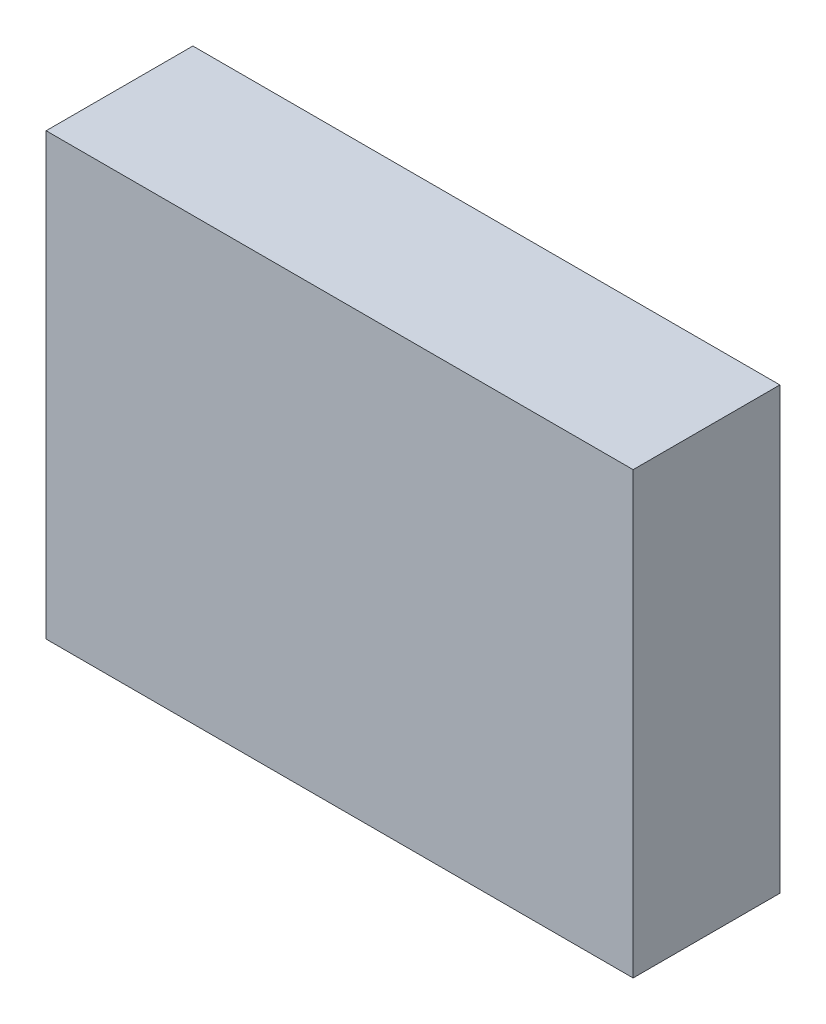
ISO-10303-21;
HEADER;
FILE_DESCRIPTION(('STEP AP214'),'2;1');
FILE_NAME('part.step','',(''),(''),'','','');
FILE_SCHEMA(('AUTOMOTIVE_DESIGN { 1 0 10303 214 1 1 1 1 }'));
ENDSEC;
DATA;
#1=APPLICATION_CONTEXT('core data for automotive mechanical design processes');
#2=APPLICATION_PROTOCOL_DEFINITION('international standard','automotive_design',2000,#1);
#3=PRODUCT_CONTEXT('',#1,'mechanical');
#4=PRODUCT('Part','Part','',(#3));
#5=PRODUCT_RELATED_PRODUCT_CATEGORY('part','',(#4));
#6=PRODUCT_DEFINITION_FORMATION('','',#4);
#7=PRODUCT_DEFINITION_CONTEXT('part definition',#1,'design');
#8=PRODUCT_DEFINITION('design','',#6,#7);
#9=PRODUCT_DEFINITION_SHAPE('','',#8);
#10=(LENGTH_UNIT() NAMED_UNIT(*) SI_UNIT(.MILLI.,.METRE.));
#11=(NAMED_UNIT(*) PLANE_ANGLE_UNIT() SI_UNIT($,.RADIAN.));
#12=(NAMED_UNIT(*) SI_UNIT($,.STERADIAN.) SOLID_ANGLE_UNIT());
#13=UNCERTAINTY_MEASURE_WITH_UNIT(LENGTH_MEASURE(1.E-05),#10,'distance_accuracy_value','');
#14=(GEOMETRIC_REPRESENTATION_CONTEXT(3) GLOBAL_UNCERTAINTY_ASSIGNED_CONTEXT((#13)) GLOBAL_UNIT_ASSIGNED_CONTEXT((#10,
#11,#12)) REPRESENTATION_CONTEXT('',''));
#15=CARTESIAN_POINT('',(0.,0.,0.));
#16=DIRECTION('',(0.,0.,1.));
#17=DIRECTION('',(1.,0.,0.));
#18=AXIS2_PLACEMENT_3D('',#15,#16,#17);
#19=CARTESIAN_POINT('',(0.,0.,0.));
#20=DIRECTION('',(0.,0.,-1.));
#21=DIRECTION('',(-1.,0.,0.));
#22=AXIS2_PLACEMENT_3D('',#19,#20,#21);
#23=PLANE('',#22);
#24=CARTESIAN_POINT('',(-45.72,33.02,0.));
#25=DIRECTION('',(0.,0.,-1.));
#26=DIRECTION('',(-1.,0.,0.));
#27=AXIS2_PLACEMENT_3D('',#24,#25,#26);
#28=CIRCLE('',#27,2.794);
#29=CARTESIAN_POINT('',(-48.514,33.02,0.));
#30=VERTEX_POINT('',#29);
#31=EDGE_CURVE('E263',#30,#30,#28,.T.);
#32=ORIENTED_EDGE('',*,*,#31,.F.);
#33=EDGE_LOOP('',(#32));
#34=FACE_BOUND('',#33,.T.);
#35=CARTESIAN_POINT('',(45.72,33.02,0.));
#36=DIRECTION('',(0.,0.,-1.));
#37=DIRECTION('',(-1.,0.,0.));
#38=AXIS2_PLACEMENT_3D('',#35,#36,#37);
#39=CIRCLE('',#38,2.794);
#40=CARTESIAN_POINT('',(42.926,33.02,0.));
#41=VERTEX_POINT('',#40);
#42=EDGE_CURVE('E270',#41,#41,#39,.T.);
#43=ORIENTED_EDGE('',*,*,#42,.F.);
#44=EDGE_LOOP('',(#43));
#45=FACE_BOUND('',#44,.T.);
#46=CARTESIAN_POINT('',(45.72,-33.02,0.));
#47=DIRECTION('',(0.,0.,-1.));
#48=DIRECTION('',(-1.,0.,0.));
#49=AXIS2_PLACEMENT_3D('',#46,#47,#48);
#50=CIRCLE('',#49,2.794);
#51=CARTESIAN_POINT('',(42.926,-33.02,0.));
#52=VERTEX_POINT('',#51);
#53=EDGE_CURVE('E276',#52,#52,#50,.T.);
#54=ORIENTED_EDGE('',*,*,#53,.F.);
#55=EDGE_LOOP('',(#54));
#56=FACE_BOUND('',#55,.T.);
#57=CARTESIAN_POINT('',(-45.72,-33.02,0.));
#58=DIRECTION('',(0.,0.,-1.));
#59=DIRECTION('',(-1.,0.,0.));
#60=AXIS2_PLACEMENT_3D('',#57,#58,#59);
#61=CIRCLE('',#60,2.794);
#62=CARTESIAN_POINT('',(-48.514,-33.02,0.));
#63=VERTEX_POINT('',#62);
#64=EDGE_CURVE('E266',#63,#63,#61,.T.);
#65=ORIENTED_EDGE('',*,*,#64,.F.);
#66=EDGE_LOOP('',(#65));
#67=FACE_BOUND('',#66,.T.);
#68=DIRECTION('',(0.,1.,0.));
#69=VECTOR('',#68,1.);
#70=CARTESIAN_POINT('',(50.8,-38.1,0.));
#71=LINE('',#70,#69);
#72=CARTESIAN_POINT('',(50.8,-38.1,0.));
#73=VERTEX_POINT('',#72);
#74=CARTESIAN_POINT('',(50.8,38.1,0.));
#75=VERTEX_POINT('',#74);
#76=EDGE_CURVE('E284',#73,#75,#71,.T.);
#77=ORIENTED_EDGE('',*,*,#76,.F.);
#78=DIRECTION('',(1.,0.,0.));
#79=VECTOR('',#78,1.);
#80=CARTESIAN_POINT('',(-50.8,-38.1,0.));
#81=LINE('',#80,#79);
#82=CARTESIAN_POINT('',(-50.8,-38.1,0.));
#83=VERTEX_POINT('',#82);
#84=EDGE_CURVE('E77',#83,#73,#81,.T.);
#85=ORIENTED_EDGE('',*,*,#84,.F.);
#86=DIRECTION('',(0.,-1.,0.));
#87=VECTOR('',#86,1.);
#88=CARTESIAN_POINT('',(-50.8,-38.1,0.));
#89=LINE('',#88,#87);
#90=CARTESIAN_POINT('',(-50.8,38.1,0.));
#91=VERTEX_POINT('',#90);
#92=EDGE_CURVE('E298',#91,#83,#89,.T.);
#93=ORIENTED_EDGE('',*,*,#92,.F.);
#94=DIRECTION('',(-1.,0.,0.));
#95=VECTOR('',#94,1.);
#96=CARTESIAN_POINT('',(-50.8,38.1,0.));
#97=LINE('',#96,#95);
#98=EDGE_CURVE('E296',#75,#91,#97,.T.);
#99=ORIENTED_EDGE('',*,*,#98,.F.);
#100=EDGE_LOOP('',(#77,#85,#93,#99));
#101=FACE_BOUND('',#100,.T.);
#102=CARTESIAN_POINT('',(-45.72,-33.02,0.));
#103=DIRECTION('',(0.,0.,-1.));
#104=DIRECTION('',(-1.,0.,0.));
#105=AXIS2_PLACEMENT_3D('',#102,#103,#104);
#106=CIRCLE('',#105,5.334);
#107=CARTESIAN_POINT('',(-48.26,-28.3295889305947,0.));
#108=VERTEX_POINT('',#107);
#109=CARTESIAN_POINT('',(-41.0295889305947,-35.56,0.));
#110=VERTEX_POINT('',#109);
#111=EDGE_CURVE('E210',#108,#110,#106,.T.);
#112=ORIENTED_EDGE('',*,*,#111,.T.);
#113=DIRECTION('',(1.,0.,0.));
#114=VECTOR('',#113,1.);
#115=CARTESIAN_POINT('',(0.,-35.56,0.));
#116=LINE('',#115,#114);
#117=CARTESIAN_POINT('',(41.0295889305947,-35.56,0.));
#118=VERTEX_POINT('',#117);
#119=EDGE_CURVE('E172',#110,#118,#116,.T.);
#120=ORIENTED_EDGE('',*,*,#119,.T.);
#121=CARTESIAN_POINT('',(45.72,-33.02,0.));
#122=DIRECTION('',(0.,0.,-1.));
#123=DIRECTION('',(-1.,0.,0.));
#124=AXIS2_PLACEMENT_3D('',#121,#122,#123);
#125=CIRCLE('',#124,5.334);
#126=CARTESIAN_POINT('',(48.26,-28.3295889305947,0.));
#127=VERTEX_POINT('',#126);
#128=EDGE_CURVE('E214',#118,#127,#125,.T.);
#129=ORIENTED_EDGE('',*,*,#128,.T.);
#130=DIRECTION('',(0.,1.,0.));
#131=VECTOR('',#130,1.);
#132=CARTESIAN_POINT('',(48.26,0.,0.));
#133=LINE('',#132,#131);
#134=CARTESIAN_POINT('',(48.26,28.3295889305947,0.));
#135=VERTEX_POINT('',#134);
#136=EDGE_CURVE('E47',#127,#135,#133,.T.);
#137=ORIENTED_EDGE('',*,*,#136,.T.);
#138=CARTESIAN_POINT('',(45.72,33.02,0.));
#139=DIRECTION('',(0.,0.,-1.));
#140=DIRECTION('',(-1.,0.,0.));
#141=AXIS2_PLACEMENT_3D('',#138,#139,#140);
#142=CIRCLE('',#141,5.334);
#143=CARTESIAN_POINT('',(41.0295889305947,35.56,0.));
#144=VERTEX_POINT('',#143);
#145=EDGE_CURVE('E207',#135,#144,#142,.T.);
#146=ORIENTED_EDGE('',*,*,#145,.T.);
#147=DIRECTION('',(-1.,0.,0.));
#148=VECTOR('',#147,1.);
#149=CARTESIAN_POINT('',(0.,35.56,0.));
#150=LINE('',#149,#148);
#151=CARTESIAN_POINT('',(-41.0295889305947,35.56,0.));
#152=VERTEX_POINT('',#151);
#153=EDGE_CURVE('E194',#144,#152,#150,.T.);
#154=ORIENTED_EDGE('',*,*,#153,.T.);
#155=CARTESIAN_POINT('',(-45.72,33.02,0.));
#156=DIRECTION('',(0.,0.,-1.));
#157=DIRECTION('',(-1.,0.,0.));
#158=AXIS2_PLACEMENT_3D('',#155,#156,#157);
#159=CIRCLE('',#158,5.334);
#160=CARTESIAN_POINT('',(-48.26,28.3295889305947,0.));
#161=VERTEX_POINT('',#160);
#162=EDGE_CURVE('E206',#152,#161,#159,.T.);
#163=ORIENTED_EDGE('',*,*,#162,.T.);
#164=DIRECTION('',(0.,-1.,0.));
#165=VECTOR('',#164,1.);
#166=CARTESIAN_POINT('',(-48.26,0.,0.));
#167=LINE('',#166,#165);
#168=EDGE_CURVE('E198',#161,#108,#167,.T.);
#169=ORIENTED_EDGE('',*,*,#168,.T.);
#170=EDGE_LOOP('',(#112,#120,#129,#137,#146,#154,#163,#169));
#171=FACE_BOUND('',#170,.T.);
#172=ADVANCED_FACE('F32',(#34,#45,#56,#67,#101,#171),#23,.T.);
#173=CARTESIAN_POINT('',(50.8,-38.1,25.4));
#174=DIRECTION('',(-1.,0.,0.));
#175=DIRECTION('',(0.,0.,1.));
#176=AXIS2_PLACEMENT_3D('',#173,#174,#175);
#177=PLANE('',#176);
#178=ORIENTED_EDGE('',*,*,#76,.T.);
#179=DIRECTION('',(0.,0.,-1.));
#180=VECTOR('',#179,1.);
#181=CARTESIAN_POINT('',(50.8,38.1,25.4));
#182=LINE('',#181,#180);
#183=CARTESIAN_POINT('',(50.8,38.1,25.4));
#184=VERTEX_POINT('',#183);
#185=EDGE_CURVE('E11',#184,#75,#182,.T.);
#186=ORIENTED_EDGE('',*,*,#185,.F.);
#187=DIRECTION('',(0.,1.,0.));
#188=VECTOR('',#187,1.);
#189=CARTESIAN_POINT('',(50.8,-38.1,25.4));
#190=LINE('',#189,#188);
#191=CARTESIAN_POINT('',(50.8,-38.1,25.4));
#192=VERTEX_POINT('',#191);
#193=EDGE_CURVE('E287',#192,#184,#190,.T.);
#194=ORIENTED_EDGE('',*,*,#193,.F.);
#195=DIRECTION('',(0.,0.,-1.));
#196=VECTOR('',#195,1.);
#197=CARTESIAN_POINT('',(50.8,-38.1,25.4));
#198=LINE('',#197,#196);
#199=EDGE_CURVE('E293',#192,#73,#198,.T.);
#200=ORIENTED_EDGE('',*,*,#199,.T.);
#201=EDGE_LOOP('',(#178,#186,#194,#200));
#202=FACE_BOUND('',#201,.T.);
#203=ADVANCED_FACE('F34',(#202),#177,.F.);
#204=CARTESIAN_POINT('',(-50.8,38.1,25.4));
#205=DIRECTION('',(0.,-1.,0.));
#206=DIRECTION('',(0.,0.,-1.));
#207=AXIS2_PLACEMENT_3D('',#204,#205,#206);
#208=PLANE('',#207);
#209=ORIENTED_EDGE('',*,*,#98,.T.);
#210=DIRECTION('',(0.,0.,-1.));
#211=VECTOR('',#210,1.);
#212=CARTESIAN_POINT('',(-50.8,38.1,25.4));
#213=LINE('',#212,#211);
#214=CARTESIAN_POINT('',(-50.8,38.1,25.4));
#215=VERTEX_POINT('',#214);
#216=EDGE_CURVE('E40',#215,#91,#213,.T.);
#217=ORIENTED_EDGE('',*,*,#216,.F.);
#218=DIRECTION('',(-1.,0.,0.));
#219=VECTOR('',#218,1.);
#220=CARTESIAN_POINT('',(-50.8,38.1,25.4));
#221=LINE('',#220,#219);
#222=EDGE_CURVE('E84',#184,#215,#221,.T.);
#223=ORIENTED_EDGE('',*,*,#222,.F.);
#224=ORIENTED_EDGE('',*,*,#185,.T.);
#225=EDGE_LOOP('',(#209,#217,#223,#224));
#226=FACE_BOUND('',#225,.T.);
#227=ADVANCED_FACE('F325',(#226),#208,.F.);
#228=CARTESIAN_POINT('',(-50.8,-38.1,25.4));
#229=DIRECTION('',(1.,0.,0.));
#230=DIRECTION('',(0.,0.,-1.));
#231=AXIS2_PLACEMENT_3D('',#228,#229,#230);
#232=PLANE('',#231);
#233=ORIENTED_EDGE('',*,*,#92,.T.);
#234=DIRECTION('',(0.,0.,-1.));
#235=VECTOR('',#234,1.);
#236=CARTESIAN_POINT('',(-50.8,-38.1,25.4));
#237=LINE('',#236,#235);
#238=CARTESIAN_POINT('',(-50.8,-38.1,25.4));
#239=VERTEX_POINT('',#238);
#240=EDGE_CURVE('E302',#239,#83,#237,.T.);
#241=ORIENTED_EDGE('',*,*,#240,.F.);
#242=DIRECTION('',(0.,-1.,0.));
#243=VECTOR('',#242,1.);
#244=CARTESIAN_POINT('',(-50.8,-38.1,25.4));
#245=LINE('',#244,#243);
#246=EDGE_CURVE('E290',#215,#239,#245,.T.);
#247=ORIENTED_EDGE('',*,*,#246,.F.);
#248=ORIENTED_EDGE('',*,*,#216,.T.);
#249=EDGE_LOOP('',(#233,#241,#247,#248));
#250=FACE_BOUND('',#249,.T.);
#251=ADVANCED_FACE('F307',(#250),#232,.F.);
#252=CARTESIAN_POINT('',(-50.8,-38.1,25.4));
#253=DIRECTION('',(0.,1.,0.));
#254=DIRECTION('',(0.,0.,1.));
#255=AXIS2_PLACEMENT_3D('',#252,#253,#254);
#256=PLANE('',#255);
#257=ORIENTED_EDGE('',*,*,#84,.T.);
#258=ORIENTED_EDGE('',*,*,#199,.F.);
#259=DIRECTION('',(1.,0.,0.));
#260=VECTOR('',#259,1.);
#261=CARTESIAN_POINT('',(-50.8,-38.1,25.4));
#262=LINE('',#261,#260);
#263=EDGE_CURVE('E56',#239,#192,#262,.T.);
#264=ORIENTED_EDGE('',*,*,#263,.F.);
#265=ORIENTED_EDGE('',*,*,#240,.T.);
#266=EDGE_LOOP('',(#257,#258,#264,#265));
#267=FACE_BOUND('',#266,.T.);
#268=ADVANCED_FACE('F315',(#267),#256,.F.);
#269=CARTESIAN_POINT('',(0.,0.,25.4));
#270=DIRECTION('',(0.,0.,-1.));
#271=DIRECTION('',(-1.,0.,0.));
#272=AXIS2_PLACEMENT_3D('',#269,#270,#271);
#273=PLANE('',#272);
#274=ORIENTED_EDGE('',*,*,#193,.T.);
#275=ORIENTED_EDGE('',*,*,#222,.T.);
#276=ORIENTED_EDGE('',*,*,#246,.T.);
#277=ORIENTED_EDGE('',*,*,#263,.T.);
#278=EDGE_LOOP('',(#274,#275,#276,#277));
#279=FACE_BOUND('',#278,.T.);
#280=ADVANCED_FACE('F317',(#279),#273,.F.);
#281=CARTESIAN_POINT('',(-45.72,-33.02,10.16));
#282=DIRECTION('',(0.,0.,-1.));
#283=DIRECTION('',(-1.,0.,0.));
#284=AXIS2_PLACEMENT_3D('',#281,#282,#283);
#285=CYLINDRICAL_SURFACE('',#284,2.794);
#286=CARTESIAN_POINT('',(-45.72,-33.02,10.16));
#287=DIRECTION('',(0.,0.,-1.));
#288=DIRECTION('',(-1.,0.,0.));
#289=AXIS2_PLACEMENT_3D('',#286,#287,#288);
#290=CIRCLE('',#289,2.794);
#291=CARTESIAN_POINT('',(-48.514,-33.02,10.16));
#292=VERTEX_POINT('',#291);
#293=EDGE_CURVE('E281',#292,#292,#290,.T.);
#294=ORIENTED_EDGE('',*,*,#293,.F.);
#295=EDGE_LOOP('',(#294));
#296=FACE_BOUND('',#295,.T.);
#297=ORIENTED_EDGE('',*,*,#64,.T.);
#298=EDGE_LOOP('',(#297));
#299=FACE_BOUND('',#298,.T.);
#300=ADVANCED_FACE('F323',(#296,#299),#285,.F.);
#301=CARTESIAN_POINT('',(-45.72,-33.02,10.16));
#302=DIRECTION('',(0.,0.,-1.));
#303=DIRECTION('',(-1.,0.,0.));
#304=AXIS2_PLACEMENT_3D('',#301,#302,#303);
#305=PLANE('',#304);
#306=ORIENTED_EDGE('',*,*,#293,.T.);
#307=EDGE_LOOP('',(#306));
#308=FACE_BOUND('',#307,.T.);
#309=ADVANCED_FACE('F338',(#308),#305,.T.);
#310=CARTESIAN_POINT('',(45.72,-33.02,10.16));
#311=DIRECTION('',(0.,0.,-1.));
#312=DIRECTION('',(-1.,0.,0.));
#313=AXIS2_PLACEMENT_3D('',#310,#311,#312);
#314=CYLINDRICAL_SURFACE('',#313,2.794);
#315=CARTESIAN_POINT('',(45.72,-33.02,10.16));
#316=DIRECTION('',(0.,0.,-1.));
#317=DIRECTION('',(-1.,0.,0.));
#318=AXIS2_PLACEMENT_3D('',#315,#316,#317);
#319=CIRCLE('',#318,2.794);
#320=CARTESIAN_POINT('',(42.926,-33.02,10.16));
#321=VERTEX_POINT('',#320);
#322=EDGE_CURVE('E262',#321,#321,#319,.T.);
#323=ORIENTED_EDGE('',*,*,#322,.F.);
#324=EDGE_LOOP('',(#323));
#325=FACE_BOUND('',#324,.T.);
#326=ORIENTED_EDGE('',*,*,#53,.T.);
#327=EDGE_LOOP('',(#326));
#328=FACE_BOUND('',#327,.T.);
#329=ADVANCED_FACE('F342',(#325,#328),#314,.F.);
#330=CARTESIAN_POINT('',(45.72,-33.02,10.16));
#331=DIRECTION('',(0.,0.,-1.));
#332=DIRECTION('',(-1.,0.,0.));
#333=AXIS2_PLACEMENT_3D('',#330,#331,#332);
#334=PLANE('',#333);
#335=ORIENTED_EDGE('',*,*,#322,.T.);
#336=EDGE_LOOP('',(#335));
#337=FACE_BOUND('',#336,.T.);
#338=ADVANCED_FACE('F344',(#337),#334,.T.);
#339=CARTESIAN_POINT('',(45.72,33.02,10.16));
#340=DIRECTION('',(0.,0.,-1.));
#341=DIRECTION('',(-1.,0.,0.));
#342=AXIS2_PLACEMENT_3D('',#339,#340,#341);
#343=CYLINDRICAL_SURFACE('',#342,2.794);
#344=CARTESIAN_POINT('',(45.72,33.02,10.16));
#345=DIRECTION('',(0.,0.,-1.));
#346=DIRECTION('',(-1.,0.,0.));
#347=AXIS2_PLACEMENT_3D('',#344,#345,#346);
#348=CIRCLE('',#347,2.794);
#349=CARTESIAN_POINT('',(42.926,33.02,10.16));
#350=VERTEX_POINT('',#349);
#351=EDGE_CURVE('E273',#350,#350,#348,.T.);
#352=ORIENTED_EDGE('',*,*,#351,.F.);
#353=EDGE_LOOP('',(#352));
#354=FACE_BOUND('',#353,.T.);
#355=ORIENTED_EDGE('',*,*,#42,.T.);
#356=EDGE_LOOP('',(#355));
#357=FACE_BOUND('',#356,.T.);
#358=ADVANCED_FACE('F347',(#354,#357),#343,.F.);
#359=CARTESIAN_POINT('',(45.72,33.02,10.16));
#360=DIRECTION('',(0.,0.,-1.));
#361=DIRECTION('',(-1.,0.,0.));
#362=AXIS2_PLACEMENT_3D('',#359,#360,#361);
#363=PLANE('',#362);
#364=ORIENTED_EDGE('',*,*,#351,.T.);
#365=EDGE_LOOP('',(#364));
#366=FACE_BOUND('',#365,.T.);
#367=ADVANCED_FACE('F352',(#366),#363,.T.);
#368=CARTESIAN_POINT('',(-45.72,33.02,10.16));
#369=DIRECTION('',(0.,0.,-1.));
#370=DIRECTION('',(-1.,0.,0.));
#371=AXIS2_PLACEMENT_3D('',#368,#369,#370);
#372=CYLINDRICAL_SURFACE('',#371,2.794);
#373=CARTESIAN_POINT('',(-45.72,33.02,10.16));
#374=DIRECTION('',(0.,0.,-1.));
#375=DIRECTION('',(-1.,0.,0.));
#376=AXIS2_PLACEMENT_3D('',#373,#374,#375);
#377=CIRCLE('',#376,2.794);
#378=CARTESIAN_POINT('',(-48.514,33.02,10.16));
#379=VERTEX_POINT('',#378);
#380=EDGE_CURVE('E267',#379,#379,#377,.T.);
#381=ORIENTED_EDGE('',*,*,#380,.F.);
#382=EDGE_LOOP('',(#381));
#383=FACE_BOUND('',#382,.T.);
#384=ORIENTED_EDGE('',*,*,#31,.T.);
#385=EDGE_LOOP('',(#384));
#386=FACE_BOUND('',#385,.T.);
#387=ADVANCED_FACE('F355',(#383,#386),#372,.F.);
#388=CARTESIAN_POINT('',(-45.72,33.02,10.16));
#389=DIRECTION('',(0.,0.,-1.));
#390=DIRECTION('',(-1.,0.,0.));
#391=AXIS2_PLACEMENT_3D('',#388,#389,#390);
#392=PLANE('',#391);
#393=ORIENTED_EDGE('',*,*,#380,.T.);
#394=EDGE_LOOP('',(#393));
#395=FACE_BOUND('',#394,.T.);
#396=ADVANCED_FACE('F360',(#395),#392,.T.);
#397=CARTESIAN_POINT('',(-50.8,35.56,25.4));
#398=DIRECTION('',(0.,-1.,0.));
#399=DIRECTION('',(0.,0.,-1.));
#400=AXIS2_PLACEMENT_3D('',#397,#398,#399);
#401=PLANE('',#400);
#402=DIRECTION('',(0.,0.,-1.));
#403=VECTOR('',#402,1.);
#404=CARTESIAN_POINT('',(-41.0295889305947,35.56,10.16));
#405=LINE('',#404,#403);
#406=CARTESIAN_POINT('',(-41.0295889305947,35.56,12.7));
#407=VERTEX_POINT('',#406);
#408=EDGE_CURVE('E241',#152,#407,#405,.F.);
#409=ORIENTED_EDGE('',*,*,#408,.F.);
#410=ORIENTED_EDGE('',*,*,#153,.F.);
#411=DIRECTION('',(0.,0.,-1.));
#412=VECTOR('',#411,1.);
#413=CARTESIAN_POINT('',(41.0295889305947,35.56,10.16));
#414=LINE('',#413,#412);
#415=CARTESIAN_POINT('',(41.0295889305947,35.56,12.7));
#416=VERTEX_POINT('',#415);
#417=EDGE_CURVE('E233',#144,#416,#414,.F.);
#418=ORIENTED_EDGE('',*,*,#417,.T.);
#419=DIRECTION('',(1.,0.,0.));
#420=VECTOR('',#419,1.);
#421=CARTESIAN_POINT('',(-50.8,35.56,12.7));
#422=LINE('',#421,#420);
#423=CARTESIAN_POINT('',(48.26,35.56,12.7));
#424=VERTEX_POINT('',#423);
#425=EDGE_CURVE('E176',#416,#424,#422,.T.);
#426=ORIENTED_EDGE('',*,*,#425,.T.);
#427=DIRECTION('',(0.,0.,-1.));
#428=VECTOR('',#427,1.);
#429=CARTESIAN_POINT('',(48.26,35.56,25.4));
#430=LINE('',#429,#428);
#431=CARTESIAN_POINT('',(48.26,35.56,22.86));
#432=VERTEX_POINT('',#431);
#433=EDGE_CURVE('E169',#432,#424,#430,.T.);
#434=ORIENTED_EDGE('',*,*,#433,.F.);
#435=DIRECTION('',(-1.,0.,0.));
#436=VECTOR('',#435,1.);
#437=CARTESIAN_POINT('',(0.,35.56,22.86));
#438=LINE('',#437,#436);
#439=CARTESIAN_POINT('',(-48.26,35.56,22.86));
#440=VERTEX_POINT('',#439);
#441=EDGE_CURVE('E155',#432,#440,#438,.T.);
#442=ORIENTED_EDGE('',*,*,#441,.T.);
#443=DIRECTION('',(0.,0.,-1.));
#444=VECTOR('',#443,1.);
#445=CARTESIAN_POINT('',(-48.26,35.56,25.4));
#446=LINE('',#445,#444);
#447=CARTESIAN_POINT('',(-48.26,35.56,12.7));
#448=VERTEX_POINT('',#447);
#449=EDGE_CURVE('E179',#440,#448,#446,.T.);
#450=ORIENTED_EDGE('',*,*,#449,.T.);
#451=DIRECTION('',(-1.,0.,0.));
#452=VECTOR('',#451,1.);
#453=CARTESIAN_POINT('',(-45.72,35.56,12.7));
#454=LINE('',#453,#452);
#455=EDGE_CURVE('E259',#407,#448,#454,.T.);
#456=ORIENTED_EDGE('',*,*,#455,.F.);
#457=EDGE_LOOP('',(#409,#410,#418,#426,#434,#442,#450,#456));
#458=FACE_BOUND('',#457,.T.);
#459=ADVANCED_FACE('F174',(#458),#401,.T.);
#460=CARTESIAN_POINT('',(48.26,-38.1,25.4));
#461=DIRECTION('',(-1.,0.,0.));
#462=DIRECTION('',(0.,0.,1.));
#463=AXIS2_PLACEMENT_3D('',#460,#461,#462);
#464=PLANE('',#463);
#465=DIRECTION('',(0.,0.,-1.));
#466=VECTOR('',#465,1.);
#467=CARTESIAN_POINT('',(48.26,28.3295889305947,10.16));
#468=LINE('',#467,#466);
#469=CARTESIAN_POINT('',(48.26,28.3295889305947,12.7));
#470=VERTEX_POINT('',#469);
#471=EDGE_CURVE('E235',#135,#470,#468,.F.);
#472=ORIENTED_EDGE('',*,*,#471,.F.);
#473=ORIENTED_EDGE('',*,*,#136,.F.);
#474=DIRECTION('',(0.,0.,-1.));
#475=VECTOR('',#474,1.);
#476=CARTESIAN_POINT('',(48.26,-28.3295889305947,10.16));
#477=LINE('',#476,#475);
#478=CARTESIAN_POINT('',(48.26,-28.3295889305947,12.7));
#479=VERTEX_POINT('',#478);
#480=EDGE_CURVE('E228',#127,#479,#477,.F.);
#481=ORIENTED_EDGE('',*,*,#480,.T.);
#482=DIRECTION('',(0.,-1.,0.));
#483=VECTOR('',#482,1.);
#484=CARTESIAN_POINT('',(48.26,-38.1,12.7));
#485=LINE('',#484,#483);
#486=CARTESIAN_POINT('',(48.26,-35.56,12.7));
#487=VERTEX_POINT('',#486);
#488=EDGE_CURVE('E251',#479,#487,#485,.T.);
#489=ORIENTED_EDGE('',*,*,#488,.T.);
#490=DIRECTION('',(0.,0.,-1.));
#491=VECTOR('',#490,1.);
#492=CARTESIAN_POINT('',(48.26,-35.56,25.4));
#493=LINE('',#492,#491);
#494=CARTESIAN_POINT('',(48.26,-35.56,22.86));
#495=VERTEX_POINT('',#494);
#496=EDGE_CURVE('E171',#495,#487,#493,.T.);
#497=ORIENTED_EDGE('',*,*,#496,.F.);
#498=DIRECTION('',(0.,1.,0.));
#499=VECTOR('',#498,1.);
#500=CARTESIAN_POINT('',(48.26,0.,22.86));
#501=LINE('',#500,#499);
#502=EDGE_CURVE('E159',#495,#432,#501,.T.);
#503=ORIENTED_EDGE('',*,*,#502,.T.);
#504=ORIENTED_EDGE('',*,*,#433,.T.);
#505=DIRECTION('',(0.,1.,0.));
#506=VECTOR('',#505,1.);
#507=CARTESIAN_POINT('',(48.26,33.02,12.7));
#508=LINE('',#507,#506);
#509=EDGE_CURVE('E257',#470,#424,#508,.T.);
#510=ORIENTED_EDGE('',*,*,#509,.F.);
#511=EDGE_LOOP('',(#472,#473,#481,#489,#497,#503,#504,#510));
#512=FACE_BOUND('',#511,.T.);
#513=ADVANCED_FACE('F168',(#512),#464,.T.);
#514=CARTESIAN_POINT('',(-48.26,-38.1,25.4));
#515=DIRECTION('',(1.,0.,0.));
#516=DIRECTION('',(0.,0.,-1.));
#517=AXIS2_PLACEMENT_3D('',#514,#515,#516);
#518=PLANE('',#517);
#519=DIRECTION('',(0.,1.,0.));
#520=VECTOR('',#519,1.);
#521=CARTESIAN_POINT('',(-48.26,-38.1,12.7));
#522=LINE('',#521,#520);
#523=CARTESIAN_POINT('',(-48.26,28.3295889305947,12.7));
#524=VERTEX_POINT('',#523);
#525=EDGE_CURVE('E249',#524,#448,#522,.T.);
#526=ORIENTED_EDGE('',*,*,#525,.T.);
#527=ORIENTED_EDGE('',*,*,#449,.F.);
#528=DIRECTION('',(0.,-1.,0.));
#529=VECTOR('',#528,1.);
#530=CARTESIAN_POINT('',(-48.26,0.,22.86));
#531=LINE('',#530,#529);
#532=CARTESIAN_POINT('',(-48.26,-35.56,22.86));
#533=VERTEX_POINT('',#532);
#534=EDGE_CURVE('E160',#440,#533,#531,.T.);
#535=ORIENTED_EDGE('',*,*,#534,.T.);
#536=DIRECTION('',(0.,0.,-1.));
#537=VECTOR('',#536,1.);
#538=CARTESIAN_POINT('',(-48.26,-35.56,25.4));
#539=LINE('',#538,#537);
#540=CARTESIAN_POINT('',(-48.26,-35.56,12.7));
#541=VERTEX_POINT('',#540);
#542=EDGE_CURVE('E184',#533,#541,#539,.T.);
#543=ORIENTED_EDGE('',*,*,#542,.T.);
#544=DIRECTION('',(0.,-1.,0.));
#545=VECTOR('',#544,1.);
#546=CARTESIAN_POINT('',(-48.26,-33.02,12.7));
#547=LINE('',#546,#545);
#548=CARTESIAN_POINT('',(-48.26,-28.3295889305947,12.7));
#549=VERTEX_POINT('',#548);
#550=EDGE_CURVE('E246',#549,#541,#547,.T.);
#551=ORIENTED_EDGE('',*,*,#550,.F.);
#552=DIRECTION('',(0.,0.,-1.));
#553=VECTOR('',#552,1.);
#554=CARTESIAN_POINT('',(-48.26,-28.3295889305947,10.16));
#555=LINE('',#554,#553);
#556=EDGE_CURVE('E182',#108,#549,#555,.F.);
#557=ORIENTED_EDGE('',*,*,#556,.F.);
#558=ORIENTED_EDGE('',*,*,#168,.F.);
#559=DIRECTION('',(0.,0.,-1.));
#560=VECTOR('',#559,1.);
#561=CARTESIAN_POINT('',(-48.26,28.3295889305947,10.16));
#562=LINE('',#561,#560);
#563=EDGE_CURVE('E238',#161,#524,#562,.F.);
#564=ORIENTED_EDGE('',*,*,#563,.T.);
#565=EDGE_LOOP('',(#526,#527,#535,#543,#551,#557,#558,#564));
#566=FACE_BOUND('',#565,.T.);
#567=ADVANCED_FACE('F404',(#566),#518,.T.);
#568=CARTESIAN_POINT('',(-50.8,-35.56,25.4));
#569=DIRECTION('',(0.,1.,0.));
#570=DIRECTION('',(0.,0.,1.));
#571=AXIS2_PLACEMENT_3D('',#568,#569,#570);
#572=PLANE('',#571);
#573=DIRECTION('',(0.,0.,-1.));
#574=VECTOR('',#573,1.);
#575=CARTESIAN_POINT('',(41.0295889305947,-35.56,10.16));
#576=LINE('',#575,#574);
#577=CARTESIAN_POINT('',(41.0295889305947,-35.56,12.7));
#578=VERTEX_POINT('',#577);
#579=EDGE_CURVE('E230',#118,#578,#576,.F.);
#580=ORIENTED_EDGE('',*,*,#579,.F.);
#581=ORIENTED_EDGE('',*,*,#119,.F.);
#582=DIRECTION('',(0.,0.,-1.));
#583=VECTOR('',#582,1.);
#584=CARTESIAN_POINT('',(-41.0295889305947,-35.56,10.16));
#585=LINE('',#584,#583);
#586=CARTESIAN_POINT('',(-41.0295889305947,-35.56,12.7));
#587=VERTEX_POINT('',#586);
#588=EDGE_CURVE('E178',#110,#587,#585,.F.);
#589=ORIENTED_EDGE('',*,*,#588,.T.);
#590=DIRECTION('',(-1.,0.,0.));
#591=VECTOR('',#590,1.);
#592=CARTESIAN_POINT('',(-50.8,-35.56,12.7));
#593=LINE('',#592,#591);
#594=EDGE_CURVE('E244',#587,#541,#593,.T.);
#595=ORIENTED_EDGE('',*,*,#594,.T.);
#596=ORIENTED_EDGE('',*,*,#542,.F.);
#597=DIRECTION('',(1.,0.,0.));
#598=VECTOR('',#597,1.);
#599=CARTESIAN_POINT('',(0.,-35.56,22.86));
#600=LINE('',#599,#598);
#601=EDGE_CURVE('E187',#533,#495,#600,.T.);
#602=ORIENTED_EDGE('',*,*,#601,.T.);
#603=ORIENTED_EDGE('',*,*,#496,.T.);
#604=DIRECTION('',(1.,0.,0.));
#605=VECTOR('',#604,1.);
#606=CARTESIAN_POINT('',(45.72,-35.56,12.7));
#607=LINE('',#606,#605);
#608=EDGE_CURVE('E253',#578,#487,#607,.T.);
#609=ORIENTED_EDGE('',*,*,#608,.F.);
#610=EDGE_LOOP('',(#580,#581,#589,#595,#596,#602,#603,#609));
#611=FACE_BOUND('',#610,.T.);
#612=ADVANCED_FACE('F401',(#611),#572,.T.);
#613=CARTESIAN_POINT('',(0.,0.,22.86));
#614=DIRECTION('',(0.,0.,-1.));
#615=DIRECTION('',(-1.,0.,0.));
#616=AXIS2_PLACEMENT_3D('',#613,#614,#615);
#617=PLANE('',#616);
#618=ORIENTED_EDGE('',*,*,#502,.F.);
#619=ORIENTED_EDGE('',*,*,#601,.F.);
#620=ORIENTED_EDGE('',*,*,#534,.F.);
#621=ORIENTED_EDGE('',*,*,#441,.F.);
#622=EDGE_LOOP('',(#618,#619,#620,#621));
#623=FACE_BOUND('',#622,.T.);
#624=ADVANCED_FACE('F157',(#623),#617,.T.);
#625=CARTESIAN_POINT('',(-45.72,-33.02,10.16));
#626=DIRECTION('',(0.,0.,-1.));
#627=DIRECTION('',(-1.,0.,0.));
#628=AXIS2_PLACEMENT_3D('',#625,#626,#627);
#629=CYLINDRICAL_SURFACE('',#628,5.334);
#630=ORIENTED_EDGE('',*,*,#556,.T.);
#631=CARTESIAN_POINT('',(-45.72,-33.02,12.7));
#632=DIRECTION('',(0.,0.,-1.));
#633=DIRECTION('',(-1.,0.,0.));
#634=AXIS2_PLACEMENT_3D('',#631,#632,#633);
#635=CIRCLE('',#634,5.334);
#636=EDGE_CURVE('E195',#549,#587,#635,.T.);
#637=ORIENTED_EDGE('',*,*,#636,.T.);
#638=ORIENTED_EDGE('',*,*,#588,.F.);
#639=ORIENTED_EDGE('',*,*,#111,.F.);
#640=EDGE_LOOP('',(#630,#637,#638,#639));
#641=FACE_BOUND('',#640,.T.);
#642=ADVANCED_FACE('F394',(#641),#629,.T.);
#643=CARTESIAN_POINT('',(-45.72,-33.02,12.7));
#644=DIRECTION('',(0.,0.,-1.));
#645=DIRECTION('',(-1.,0.,0.));
#646=AXIS2_PLACEMENT_3D('',#643,#644,#645);
#647=PLANE('',#646);
#648=ORIENTED_EDGE('',*,*,#550,.T.);
#649=ORIENTED_EDGE('',*,*,#594,.F.);
#650=ORIENTED_EDGE('',*,*,#636,.F.);
#651=EDGE_LOOP('',(#648,#649,#650));
#652=FACE_BOUND('',#651,.T.);
#653=ADVANCED_FACE('F390',(#652),#647,.F.);
#654=CARTESIAN_POINT('',(45.72,-33.02,10.16));
#655=DIRECTION('',(0.,0.,-1.));
#656=DIRECTION('',(-1.,0.,0.));
#657=AXIS2_PLACEMENT_3D('',#654,#655,#656);
#658=CYLINDRICAL_SURFACE('',#657,5.334);
#659=ORIENTED_EDGE('',*,*,#579,.T.);
#660=CARTESIAN_POINT('',(45.72,-33.02,12.7));
#661=DIRECTION('',(0.,0.,-1.));
#662=DIRECTION('',(-1.,0.,0.));
#663=AXIS2_PLACEMENT_3D('',#660,#661,#662);
#664=CIRCLE('',#663,5.334);
#665=EDGE_CURVE('E217',#578,#479,#664,.T.);
#666=ORIENTED_EDGE('',*,*,#665,.T.);
#667=ORIENTED_EDGE('',*,*,#480,.F.);
#668=ORIENTED_EDGE('',*,*,#128,.F.);
#669=EDGE_LOOP('',(#659,#666,#667,#668));
#670=FACE_BOUND('',#669,.T.);
#671=ADVANCED_FACE('F386',(#670),#658,.T.);
#672=CARTESIAN_POINT('',(45.72,-33.02,12.7));
#673=DIRECTION('',(0.,0.,-1.));
#674=DIRECTION('',(-1.,0.,0.));
#675=AXIS2_PLACEMENT_3D('',#672,#673,#674);
#676=PLANE('',#675);
#677=ORIENTED_EDGE('',*,*,#608,.T.);
#678=ORIENTED_EDGE('',*,*,#488,.F.);
#679=ORIENTED_EDGE('',*,*,#665,.F.);
#680=EDGE_LOOP('',(#677,#678,#679));
#681=FACE_BOUND('',#680,.T.);
#682=ADVANCED_FACE('F382',(#681),#676,.F.);
#683=CARTESIAN_POINT('',(45.72,33.02,10.16));
#684=DIRECTION('',(0.,0.,-1.));
#685=DIRECTION('',(-1.,0.,0.));
#686=AXIS2_PLACEMENT_3D('',#683,#684,#685);
#687=CYLINDRICAL_SURFACE('',#686,5.334);
#688=ORIENTED_EDGE('',*,*,#471,.T.);
#689=CARTESIAN_POINT('',(45.72,33.02,12.7));
#690=DIRECTION('',(0.,0.,-1.));
#691=DIRECTION('',(-1.,0.,0.));
#692=AXIS2_PLACEMENT_3D('',#689,#690,#691);
#693=CIRCLE('',#692,5.334);
#694=EDGE_CURVE('E211',#470,#416,#693,.T.);
#695=ORIENTED_EDGE('',*,*,#694,.T.);
#696=ORIENTED_EDGE('',*,*,#417,.F.);
#697=ORIENTED_EDGE('',*,*,#145,.F.);
#698=EDGE_LOOP('',(#688,#695,#696,#697));
#699=FACE_BOUND('',#698,.T.);
#700=ADVANCED_FACE('F378',(#699),#687,.T.);
#701=CARTESIAN_POINT('',(45.72,33.02,12.7));
#702=DIRECTION('',(0.,0.,-1.));
#703=DIRECTION('',(-1.,0.,0.));
#704=AXIS2_PLACEMENT_3D('',#701,#702,#703);
#705=PLANE('',#704);
#706=ORIENTED_EDGE('',*,*,#509,.T.);
#707=ORIENTED_EDGE('',*,*,#425,.F.);
#708=ORIENTED_EDGE('',*,*,#694,.F.);
#709=EDGE_LOOP('',(#706,#707,#708));
#710=FACE_BOUND('',#709,.T.);
#711=ADVANCED_FACE('F374',(#710),#705,.F.);
#712=CARTESIAN_POINT('',(-45.72,33.02,10.16));
#713=DIRECTION('',(0.,0.,-1.));
#714=DIRECTION('',(-1.,0.,0.));
#715=AXIS2_PLACEMENT_3D('',#712,#713,#714);
#716=CYLINDRICAL_SURFACE('',#715,5.334);
#717=ORIENTED_EDGE('',*,*,#408,.T.);
#718=CARTESIAN_POINT('',(-45.72,33.02,12.7));
#719=DIRECTION('',(0.,0.,-1.));
#720=DIRECTION('',(-1.,0.,0.));
#721=AXIS2_PLACEMENT_3D('',#718,#719,#720);
#722=CIRCLE('',#721,5.334);
#723=EDGE_CURVE('E203',#407,#524,#722,.T.);
#724=ORIENTED_EDGE('',*,*,#723,.T.);
#725=ORIENTED_EDGE('',*,*,#563,.F.);
#726=ORIENTED_EDGE('',*,*,#162,.F.);
#727=EDGE_LOOP('',(#717,#724,#725,#726));
#728=FACE_BOUND('',#727,.T.);
#729=ADVANCED_FACE('F370',(#728),#716,.T.);
#730=CARTESIAN_POINT('',(-45.72,33.02,12.7));
#731=DIRECTION('',(0.,0.,-1.));
#732=DIRECTION('',(-1.,0.,0.));
#733=AXIS2_PLACEMENT_3D('',#730,#731,#732);
#734=PLANE('',#733);
#735=ORIENTED_EDGE('',*,*,#455,.T.);
#736=ORIENTED_EDGE('',*,*,#525,.F.);
#737=ORIENTED_EDGE('',*,*,#723,.F.);
#738=EDGE_LOOP('',(#735,#736,#737));
#739=FACE_BOUND('',#738,.T.);
#740=ADVANCED_FACE('F367',(#739),#734,.F.);
#741=CLOSED_SHELL('',(#172,#203,#227,#251,#268,#280,#300,#309,#329,#338,#358,#367,#387,#396,
#459,#513,#567,#612,#624,#642,#653,#671,#682,#700,#711,#729,#740));
#742=MANIFOLD_SOLID_BREP('B2',#741);
#743=ADVANCED_BREP_SHAPE_REPRESENTATION('',(#18,#742),#14);
#744=SHAPE_DEFINITION_REPRESENTATION(#9,#743);
ENDSEC;
END-ISO-10303-21;
